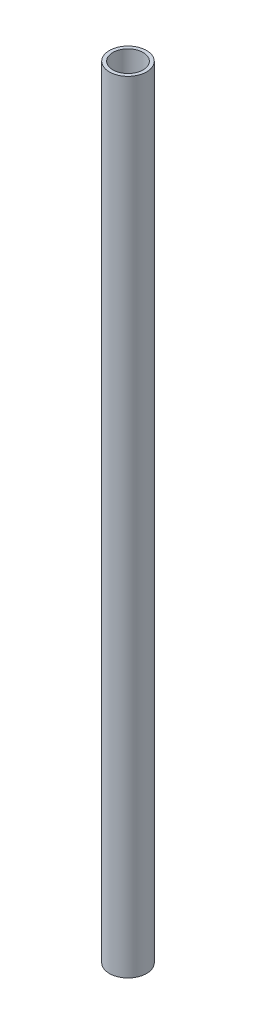
ISO-10303-21;
HEADER;
FILE_DESCRIPTION(('STEP AP214'),'2;1');
FILE_NAME('part.step','',(''),(''),'','','');
FILE_SCHEMA(('AUTOMOTIVE_DESIGN { 1 0 10303 214 1 1 1 1 }'));
ENDSEC;
DATA;
#1=APPLICATION_CONTEXT('core data for automotive mechanical design processes');
#2=APPLICATION_PROTOCOL_DEFINITION('international standard','automotive_design',2000,#1);
#3=PRODUCT_CONTEXT('',#1,'mechanical');
#4=PRODUCT('Part','Part','',(#3));
#5=PRODUCT_RELATED_PRODUCT_CATEGORY('part','',(#4));
#6=PRODUCT_DEFINITION_FORMATION('','',#4);
#7=PRODUCT_DEFINITION_CONTEXT('part definition',#1,'design');
#8=PRODUCT_DEFINITION('design','',#6,#7);
#9=PRODUCT_DEFINITION_SHAPE('','',#8);
#10=(LENGTH_UNIT() NAMED_UNIT(*) SI_UNIT(.MILLI.,.METRE.));
#11=(NAMED_UNIT(*) PLANE_ANGLE_UNIT() SI_UNIT($,.RADIAN.));
#12=(NAMED_UNIT(*) SI_UNIT($,.STERADIAN.) SOLID_ANGLE_UNIT());
#13=UNCERTAINTY_MEASURE_WITH_UNIT(LENGTH_MEASURE(1.E-05),#10,'distance_accuracy_value','');
#14=(GEOMETRIC_REPRESENTATION_CONTEXT(3) GLOBAL_UNCERTAINTY_ASSIGNED_CONTEXT((#13)) GLOBAL_UNIT_ASSIGNED_CONTEXT((#10,
#11,#12)) REPRESENTATION_CONTEXT('',''));
#15=CARTESIAN_POINT('',(0.,0.,0.));
#16=DIRECTION('',(0.,0.,1.));
#17=DIRECTION('',(1.,0.,0.));
#18=AXIS2_PLACEMENT_3D('',#15,#16,#17);
#19=CARTESIAN_POINT('',(0.,200.000108,0.));
#20=DIRECTION('',(0.,1.,0.));
#21=DIRECTION('',(0.,0.,1.));
#22=AXIS2_PLACEMENT_3D('',#19,#20,#21);
#23=PLANE('',#22);
#24=CARTESIAN_POINT('',(0.,200.000108,0.));
#25=DIRECTION('',(0.,1.,0.));
#26=DIRECTION('',(0.,0.,1.));
#27=AXIS2_PLACEMENT_3D('',#24,#25,#26);
#28=CIRCLE('',#27,4.7625);
#29=CARTESIAN_POINT('',(0.,200.000108,4.7625));
#30=VERTEX_POINT('',#29);
#31=EDGE_CURVE('E10',#30,#30,#28,.T.);
#32=ORIENTED_EDGE('',*,*,#31,.T.);
#33=EDGE_LOOP('',(#32));
#34=FACE_BOUND('',#33,.T.);
#35=CARTESIAN_POINT('',(0.,200.000108,0.));
#36=DIRECTION('',(0.,1.,0.));
#37=DIRECTION('',(0.,0.,1.));
#38=AXIS2_PLACEMENT_3D('',#35,#36,#37);
#39=CIRCLE('',#38,3.8735);
#40=CARTESIAN_POINT('',(0.,200.000108,3.8735));
#41=VERTEX_POINT('',#40);
#42=EDGE_CURVE('E44',#41,#41,#39,.T.);
#43=ORIENTED_EDGE('',*,*,#42,.F.);
#44=EDGE_LOOP('',(#43));
#45=FACE_BOUND('',#44,.T.);
#46=ADVANCED_FACE('F33',(#34,#45),#23,.T.);
#47=CARTESIAN_POINT('',(0.,0.,0.));
#48=DIRECTION('',(0.,1.,0.));
#49=DIRECTION('',(0.,0.,1.));
#50=AXIS2_PLACEMENT_3D('',#47,#48,#49);
#51=PLANE('',#50);
#52=CARTESIAN_POINT('',(0.,0.,0.));
#53=DIRECTION('',(0.,1.,0.));
#54=DIRECTION('',(0.,0.,1.));
#55=AXIS2_PLACEMENT_3D('',#52,#53,#54);
#56=CIRCLE('',#55,4.7625);
#57=CARTESIAN_POINT('',(0.,0.,4.7625));
#58=VERTEX_POINT('',#57);
#59=EDGE_CURVE('E37',#58,#58,#56,.T.);
#60=ORIENTED_EDGE('',*,*,#59,.F.);
#61=EDGE_LOOP('',(#60));
#62=FACE_BOUND('',#61,.T.);
#63=CARTESIAN_POINT('',(0.,0.,0.));
#64=DIRECTION('',(0.,1.,0.));
#65=DIRECTION('',(0.,0.,1.));
#66=AXIS2_PLACEMENT_3D('',#63,#64,#65);
#67=CIRCLE('',#66,3.8735);
#68=CARTESIAN_POINT('',(0.,0.,3.8735));
#69=VERTEX_POINT('',#68);
#70=EDGE_CURVE('E46',#69,#69,#67,.T.);
#71=ORIENTED_EDGE('',*,*,#70,.T.);
#72=EDGE_LOOP('',(#71));
#73=FACE_BOUND('',#72,.T.);
#74=ADVANCED_FACE('F56',(#62,#73),#51,.F.);
#75=CARTESIAN_POINT('',(0.,200.000108,0.));
#76=DIRECTION('',(0.,-1.,0.));
#77=DIRECTION('',(0.,0.,-1.));
#78=AXIS2_PLACEMENT_3D('',#75,#76,#77);
#79=CYLINDRICAL_SURFACE('',#78,4.7625);
#80=ORIENTED_EDGE('',*,*,#31,.F.);
#81=EDGE_LOOP('',(#80));
#82=FACE_BOUND('',#81,.T.);
#83=ORIENTED_EDGE('',*,*,#59,.T.);
#84=EDGE_LOOP('',(#83));
#85=FACE_BOUND('',#84,.T.);
#86=ADVANCED_FACE('F35',(#82,#85),#79,.T.);
#87=CARTESIAN_POINT('',(0.,200.000108,0.));
#88=DIRECTION('',(0.,-1.,0.));
#89=DIRECTION('',(0.,0.,-1.));
#90=AXIS2_PLACEMENT_3D('',#87,#88,#89);
#91=CYLINDRICAL_SURFACE('',#90,3.8735);
#92=ORIENTED_EDGE('',*,*,#42,.T.);
#93=EDGE_LOOP('',(#92));
#94=FACE_BOUND('',#93,.T.);
#95=ORIENTED_EDGE('',*,*,#70,.F.);
#96=EDGE_LOOP('',(#95));
#97=FACE_BOUND('',#96,.T.);
#98=ADVANCED_FACE('F52',(#94,#97),#91,.F.);
#99=CLOSED_SHELL('',(#46,#74,#86,#98));
#100=MANIFOLD_SOLID_BREP('B2',#99);
#101=ADVANCED_BREP_SHAPE_REPRESENTATION('',(#18,#100),#14);
#102=SHAPE_DEFINITION_REPRESENTATION(#9,#101);
ENDSEC;
END-ISO-10303-21;
